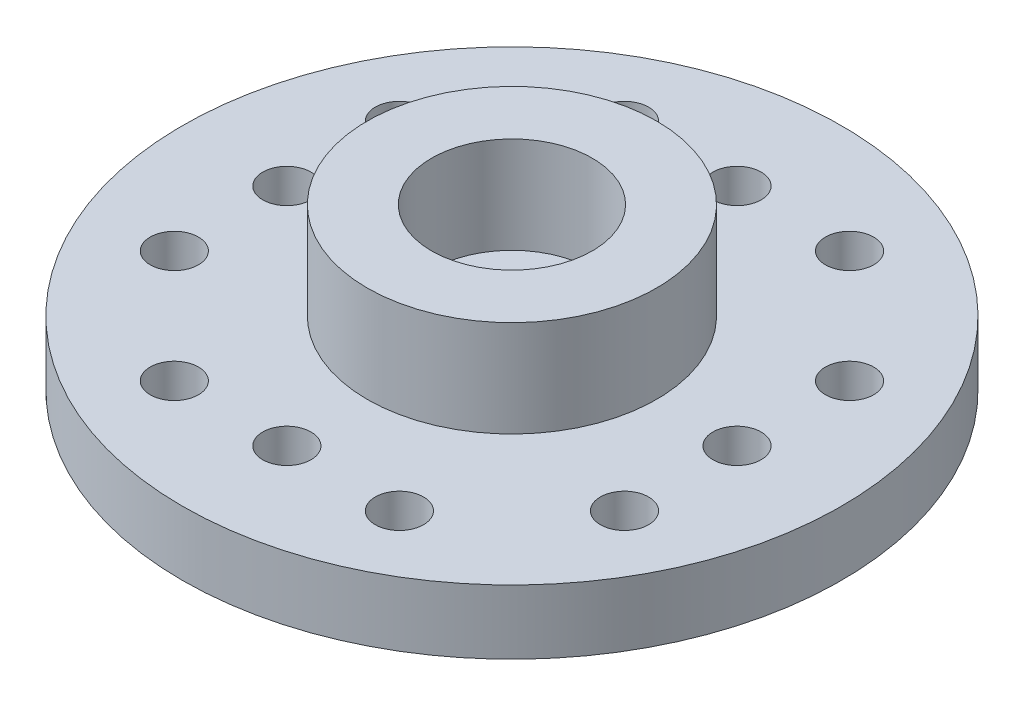
ISO-10303-21;
HEADER;
FILE_DESCRIPTION(('STEP AP214'),'2;1');
FILE_NAME('part.step','',(''),(''),'','','');
FILE_SCHEMA(('AUTOMOTIVE_DESIGN { 1 0 10303 214 1 1 1 1 }'));
ENDSEC;
DATA;
#1=APPLICATION_CONTEXT('core data for automotive mechanical design processes');
#2=APPLICATION_PROTOCOL_DEFINITION('international standard','automotive_design',2000,#1);
#3=PRODUCT_CONTEXT('',#1,'mechanical');
#4=PRODUCT('Part','Part','',(#3));
#5=PRODUCT_RELATED_PRODUCT_CATEGORY('part','',(#4));
#6=PRODUCT_DEFINITION_FORMATION('','',#4);
#7=PRODUCT_DEFINITION_CONTEXT('part definition',#1,'design');
#8=PRODUCT_DEFINITION('design','',#6,#7);
#9=PRODUCT_DEFINITION_SHAPE('','',#8);
#10=(LENGTH_UNIT() NAMED_UNIT(*) SI_UNIT(.MILLI.,.METRE.));
#11=(NAMED_UNIT(*) PLANE_ANGLE_UNIT() SI_UNIT($,.RADIAN.));
#12=(NAMED_UNIT(*) SI_UNIT($,.STERADIAN.) SOLID_ANGLE_UNIT());
#13=UNCERTAINTY_MEASURE_WITH_UNIT(LENGTH_MEASURE(1.E-05),#10,'distance_accuracy_value','');
#14=(GEOMETRIC_REPRESENTATION_CONTEXT(3) GLOBAL_UNCERTAINTY_ASSIGNED_CONTEXT((#13)) GLOBAL_UNIT_ASSIGNED_CONTEXT((#10,
#11,#12)) REPRESENTATION_CONTEXT('',''));
#15=CARTESIAN_POINT('',(0.,0.,0.));
#16=DIRECTION('',(0.,0.,1.));
#17=DIRECTION('',(1.,0.,0.));
#18=AXIS2_PLACEMENT_3D('',#15,#16,#17);
#19=CARTESIAN_POINT('',(0.,2.,0.));
#20=DIRECTION('',(0.,-1.,0.));
#21=DIRECTION('',(0.,0.,-1.));
#22=AXIS2_PLACEMENT_3D('',#19,#20,#21);
#23=CYLINDRICAL_SURFACE('',#22,10.25);
#24=CARTESIAN_POINT('',(0.,2.,0.));
#25=DIRECTION('',(0.,1.,0.));
#26=DIRECTION('',(0.,0.,1.));
#27=AXIS2_PLACEMENT_3D('',#24,#25,#26);
#28=CIRCLE('',#27,10.25);
#29=CARTESIAN_POINT('',(0.,2.,10.25));
#30=VERTEX_POINT('',#29);
#31=EDGE_CURVE('E45',#30,#30,#28,.T.);
#32=ORIENTED_EDGE('',*,*,#31,.F.);
#33=EDGE_LOOP('',(#32));
#34=FACE_BOUND('',#33,.T.);
#35=CARTESIAN_POINT('',(0.,0.,0.));
#36=DIRECTION('',(0.,1.,0.));
#37=DIRECTION('',(0.,0.,1.));
#38=AXIS2_PLACEMENT_3D('',#35,#36,#37);
#39=CIRCLE('',#38,10.25);
#40=CARTESIAN_POINT('',(0.,0.,10.25));
#41=VERTEX_POINT('',#40);
#42=EDGE_CURVE('E50',#41,#41,#39,.T.);
#43=ORIENTED_EDGE('',*,*,#42,.T.);
#44=EDGE_LOOP('',(#43));
#45=FACE_BOUND('',#44,.T.);
#46=ADVANCED_FACE('F37',(#34,#45),#23,.T.);
#47=CARTESIAN_POINT('',(0.,2.,0.));
#48=DIRECTION('',(0.,1.,0.));
#49=DIRECTION('',(0.,0.,1.));
#50=AXIS2_PLACEMENT_3D('',#47,#48,#49);
#51=PLANE('',#50);
#52=CARTESIAN_POINT('',(-6.99999999999999,2.,-3.50000000000002));
#53=DIRECTION('',(0.,1.,0.));
#54=DIRECTION('',(0.,0.,1.));
#55=AXIS2_PLACEMENT_3D('',#52,#53,#54);
#56=CIRCLE('',#55,0.75);
#57=CARTESIAN_POINT('',(-6.99999999999999,2.,-2.75000000000002));
#58=VERTEX_POINT('',#57);
#59=EDGE_CURVE('E93',#58,#58,#56,.T.);
#60=ORIENTED_EDGE('',*,*,#59,.F.);
#61=EDGE_LOOP('',(#60));
#62=FACE_BOUND('',#61,.T.);
#63=CARTESIAN_POINT('',(-7.00000000000001,2.,3.49999999999998));
#64=DIRECTION('',(0.,1.,0.));
#65=DIRECTION('',(0.,0.,1.));
#66=AXIS2_PLACEMENT_3D('',#63,#64,#65);
#67=CIRCLE('',#66,0.75);
#68=CARTESIAN_POINT('',(-7.00000000000001,2.,4.24999999999998));
#69=VERTEX_POINT('',#68);
#70=EDGE_CURVE('E100',#69,#69,#67,.T.);
#71=ORIENTED_EDGE('',*,*,#70,.F.);
#72=EDGE_LOOP('',(#71));
#73=FACE_BOUND('',#72,.T.);
#74=CARTESIAN_POINT('',(0.,2.,-7.));
#75=DIRECTION('',(0.,1.,0.));
#76=DIRECTION('',(0.,0.,1.));
#77=AXIS2_PLACEMENT_3D('',#74,#75,#76);
#78=CIRCLE('',#77,0.75);
#79=CARTESIAN_POINT('',(0.,2.,-6.25));
#80=VERTEX_POINT('',#79);
#81=EDGE_CURVE('E104',#80,#80,#78,.T.);
#82=ORIENTED_EDGE('',*,*,#81,.F.);
#83=EDGE_LOOP('',(#82));
#84=FACE_BOUND('',#83,.T.);
#85=CARTESIAN_POINT('',(3.5,2.,-7.));
#86=DIRECTION('',(0.,1.,0.));
#87=DIRECTION('',(0.,0.,1.));
#88=AXIS2_PLACEMENT_3D('',#85,#86,#87);
#89=CIRCLE('',#88,0.75);
#90=CARTESIAN_POINT('',(3.5,2.,-6.25));
#91=VERTEX_POINT('',#90);
#92=EDGE_CURVE('E108',#91,#91,#89,.T.);
#93=ORIENTED_EDGE('',*,*,#92,.F.);
#94=EDGE_LOOP('',(#93));
#95=FACE_BOUND('',#94,.T.);
#96=CARTESIAN_POINT('',(7.00000000000004,2.,-3.49999999999993));
#97=DIRECTION('',(0.,1.,0.));
#98=DIRECTION('',(0.,0.,1.));
#99=AXIS2_PLACEMENT_3D('',#96,#97,#98);
#100=CIRCLE('',#99,0.75);
#101=CARTESIAN_POINT('',(7.00000000000004,2.,-2.74999999999993));
#102=VERTEX_POINT('',#101);
#103=EDGE_CURVE('E112',#102,#102,#100,.T.);
#104=ORIENTED_EDGE('',*,*,#103,.F.);
#105=EDGE_LOOP('',(#104));
#106=FACE_BOUND('',#105,.T.);
#107=CARTESIAN_POINT('',(6.99999999999996,2.,3.50000000000007));
#108=DIRECTION('',(0.,1.,0.));
#109=DIRECTION('',(0.,0.,1.));
#110=AXIS2_PLACEMENT_3D('',#107,#108,#109);
#111=CIRCLE('',#110,0.75);
#112=CARTESIAN_POINT('',(6.99999999999996,2.,4.25000000000007));
#113=VERTEX_POINT('',#112);
#114=EDGE_CURVE('E116',#113,#113,#111,.T.);
#115=ORIENTED_EDGE('',*,*,#114,.F.);
#116=EDGE_LOOP('',(#115));
#117=FACE_BOUND('',#116,.T.);
#118=CARTESIAN_POINT('',(7.,2.,0.));
#119=DIRECTION('',(0.,1.,0.));
#120=DIRECTION('',(0.,0.,1.));
#121=AXIS2_PLACEMENT_3D('',#118,#119,#120);
#122=CIRCLE('',#121,0.75);
#123=CARTESIAN_POINT('',(7.,2.,0.750000000000073));
#124=VERTEX_POINT('',#123);
#125=EDGE_CURVE('E120',#124,#124,#122,.T.);
#126=ORIENTED_EDGE('',*,*,#125,.F.);
#127=EDGE_LOOP('',(#126));
#128=FACE_BOUND('',#127,.T.);
#129=CARTESIAN_POINT('',(-3.5,2.,-7.));
#130=DIRECTION('',(0.,1.,0.));
#131=DIRECTION('',(0.,0.,1.));
#132=AXIS2_PLACEMENT_3D('',#129,#130,#131);
#133=CIRCLE('',#132,0.75);
#134=CARTESIAN_POINT('',(-3.5,2.,-6.25));
#135=VERTEX_POINT('',#134);
#136=EDGE_CURVE('E124',#135,#135,#133,.T.);
#137=ORIENTED_EDGE('',*,*,#136,.F.);
#138=EDGE_LOOP('',(#137));
#139=FACE_BOUND('',#138,.T.);
#140=CARTESIAN_POINT('',(-7.,2.,0.));
#141=DIRECTION('',(0.,1.,0.));
#142=DIRECTION('',(0.,0.,1.));
#143=AXIS2_PLACEMENT_3D('',#140,#141,#142);
#144=CIRCLE('',#143,0.75);
#145=CARTESIAN_POINT('',(-7.,2.,0.749999999999976));
#146=VERTEX_POINT('',#145);
#147=EDGE_CURVE('E128',#146,#146,#144,.T.);
#148=ORIENTED_EDGE('',*,*,#147,.F.);
#149=EDGE_LOOP('',(#148));
#150=FACE_BOUND('',#149,.T.);
#151=CARTESIAN_POINT('',(3.5,2.,7.));
#152=DIRECTION('',(0.,1.,0.));
#153=DIRECTION('',(0.,0.,1.));
#154=AXIS2_PLACEMENT_3D('',#151,#152,#153);
#155=CIRCLE('',#154,0.75);
#156=CARTESIAN_POINT('',(3.5,2.,7.75));
#157=VERTEX_POINT('',#156);
#158=EDGE_CURVE('E72',#157,#157,#155,.T.);
#159=ORIENTED_EDGE('',*,*,#158,.F.);
#160=EDGE_LOOP('',(#159));
#161=FACE_BOUND('',#160,.T.);
#162=CARTESIAN_POINT('',(-3.5,2.,7.));
#163=DIRECTION('',(0.,1.,0.));
#164=DIRECTION('',(0.,0.,1.));
#165=AXIS2_PLACEMENT_3D('',#162,#163,#164);
#166=CIRCLE('',#165,0.75);
#167=CARTESIAN_POINT('',(-3.5,2.,7.75));
#168=VERTEX_POINT('',#167);
#169=EDGE_CURVE('E76',#168,#168,#166,.T.);
#170=ORIENTED_EDGE('',*,*,#169,.F.);
#171=EDGE_LOOP('',(#170));
#172=FACE_BOUND('',#171,.T.);
#173=CARTESIAN_POINT('',(0.,2.,7.));
#174=DIRECTION('',(0.,1.,0.));
#175=DIRECTION('',(0.,0.,1.));
#176=AXIS2_PLACEMENT_3D('',#173,#174,#175);
#177=CIRCLE('',#176,0.75);
#178=CARTESIAN_POINT('',(0.,2.,7.75));
#179=VERTEX_POINT('',#178);
#180=EDGE_CURVE('E80',#179,#179,#177,.T.);
#181=ORIENTED_EDGE('',*,*,#180,.F.);
#182=EDGE_LOOP('',(#181));
#183=FACE_BOUND('',#182,.T.);
#184=CARTESIAN_POINT('',(0.,2.,0.));
#185=DIRECTION('',(0.,1.,0.));
#186=DIRECTION('',(0.,0.,1.));
#187=AXIS2_PLACEMENT_3D('',#184,#185,#186);
#188=CIRCLE('',#187,4.5);
#189=CARTESIAN_POINT('',(0.,2.,4.5));
#190=VERTEX_POINT('',#189);
#191=EDGE_CURVE('E57',#190,#190,#188,.T.);
#192=ORIENTED_EDGE('',*,*,#191,.F.);
#193=EDGE_LOOP('',(#192));
#194=FACE_BOUND('',#193,.T.);
#195=ORIENTED_EDGE('',*,*,#31,.T.);
#196=EDGE_LOOP('',(#195));
#197=FACE_BOUND('',#196,.T.);
#198=ADVANCED_FACE('F175',(#62,#73,#84,#95,#106,#117,#128,#139,#150,#161,#172,#183,#194,#197),
#51,.T.);
#199=CARTESIAN_POINT('',(0.,0.,0.));
#200=DIRECTION('',(0.,1.,0.));
#201=DIRECTION('',(0.,0.,1.));
#202=AXIS2_PLACEMENT_3D('',#199,#200,#201);
#203=PLANE('',#202);
#204=CARTESIAN_POINT('',(-6.99999999999999,0.,-3.50000000000002));
#205=DIRECTION('',(0.,-1.,0.));
#206=DIRECTION('',(1.,0.,0.));
#207=AXIS2_PLACEMENT_3D('',#204,#205,#206);
#208=CIRCLE('',#207,0.75);
#209=CARTESIAN_POINT('',(-6.24999999999999,0.,-3.50000000000002));
#210=VERTEX_POINT('',#209);
#211=EDGE_CURVE('E136',#210,#210,#208,.T.);
#212=ORIENTED_EDGE('',*,*,#211,.F.);
#213=EDGE_LOOP('',(#212));
#214=FACE_BOUND('',#213,.T.);
#215=CARTESIAN_POINT('',(-7.00000000000001,0.,3.49999999999998));
#216=DIRECTION('',(0.,-1.,0.));
#217=DIRECTION('',(1.,0.,0.));
#218=AXIS2_PLACEMENT_3D('',#215,#216,#217);
#219=CIRCLE('',#218,0.75);
#220=CARTESIAN_POINT('',(-6.25000000000001,0.,3.49999999999998));
#221=VERTEX_POINT('',#220);
#222=EDGE_CURVE('E146',#221,#221,#219,.T.);
#223=ORIENTED_EDGE('',*,*,#222,.F.);
#224=EDGE_LOOP('',(#223));
#225=FACE_BOUND('',#224,.T.);
#226=CARTESIAN_POINT('',(0.,0.,-7.));
#227=DIRECTION('',(0.,-1.,0.));
#228=DIRECTION('',(0.,0.,1.));
#229=AXIS2_PLACEMENT_3D('',#226,#227,#228);
#230=CIRCLE('',#229,0.75);
#231=CARTESIAN_POINT('',(0.,0.,-6.25));
#232=VERTEX_POINT('',#231);
#233=EDGE_CURVE('E141',#232,#232,#230,.T.);
#234=ORIENTED_EDGE('',*,*,#233,.F.);
#235=EDGE_LOOP('',(#234));
#236=FACE_BOUND('',#235,.T.);
#237=CARTESIAN_POINT('',(3.5,0.,-7.));
#238=DIRECTION('',(0.,-1.,0.));
#239=DIRECTION('',(0.,0.,1.));
#240=AXIS2_PLACEMENT_3D('',#237,#238,#239);
#241=CIRCLE('',#240,0.75);
#242=CARTESIAN_POINT('',(3.5,0.,-6.25));
#243=VERTEX_POINT('',#242);
#244=EDGE_CURVE('E137',#243,#243,#241,.T.);
#245=ORIENTED_EDGE('',*,*,#244,.F.);
#246=EDGE_LOOP('',(#245));
#247=FACE_BOUND('',#246,.T.);
#248=CARTESIAN_POINT('',(7.00000000000004,0.,-3.49999999999993));
#249=DIRECTION('',(0.,-1.,0.));
#250=DIRECTION('',(-1.,0.,0.));
#251=AXIS2_PLACEMENT_3D('',#248,#249,#250);
#252=CIRCLE('',#251,0.75);
#253=CARTESIAN_POINT('',(6.25000000000004,0.,-3.49999999999993));
#254=VERTEX_POINT('',#253);
#255=EDGE_CURVE('E161',#254,#254,#252,.T.);
#256=ORIENTED_EDGE('',*,*,#255,.F.);
#257=EDGE_LOOP('',(#256));
#258=FACE_BOUND('',#257,.T.);
#259=CARTESIAN_POINT('',(6.99999999999996,0.,3.50000000000007));
#260=DIRECTION('',(0.,-1.,0.));
#261=DIRECTION('',(-1.,0.,0.));
#262=AXIS2_PLACEMENT_3D('',#259,#260,#261);
#263=CIRCLE('',#262,0.75);
#264=CARTESIAN_POINT('',(6.24999999999996,0.,3.50000000000007));
#265=VERTEX_POINT('',#264);
#266=EDGE_CURVE('E157',#265,#265,#263,.T.);
#267=ORIENTED_EDGE('',*,*,#266,.F.);
#268=EDGE_LOOP('',(#267));
#269=FACE_BOUND('',#268,.T.);
#270=CARTESIAN_POINT('',(7.,0.,0.));
#271=DIRECTION('',(0.,-1.,0.));
#272=DIRECTION('',(-1.,0.,0.));
#273=AXIS2_PLACEMENT_3D('',#270,#271,#272);
#274=CIRCLE('',#273,0.75);
#275=CARTESIAN_POINT('',(6.25,0.,0.));
#276=VERTEX_POINT('',#275);
#277=EDGE_CURVE('E153',#276,#276,#274,.T.);
#278=ORIENTED_EDGE('',*,*,#277,.F.);
#279=EDGE_LOOP('',(#278));
#280=FACE_BOUND('',#279,.T.);
#281=CARTESIAN_POINT('',(-3.5,0.,-7.));
#282=DIRECTION('',(0.,-1.,0.));
#283=DIRECTION('',(0.,0.,1.));
#284=AXIS2_PLACEMENT_3D('',#281,#282,#283);
#285=CIRCLE('',#284,0.75);
#286=CARTESIAN_POINT('',(-3.5,0.,-6.25));
#287=VERTEX_POINT('',#286);
#288=EDGE_CURVE('E142',#287,#287,#285,.T.);
#289=ORIENTED_EDGE('',*,*,#288,.F.);
#290=EDGE_LOOP('',(#289));
#291=FACE_BOUND('',#290,.T.);
#292=CARTESIAN_POINT('',(-7.,0.,0.));
#293=DIRECTION('',(0.,-1.,0.));
#294=DIRECTION('',(1.,0.,0.));
#295=AXIS2_PLACEMENT_3D('',#292,#293,#294);
#296=CIRCLE('',#295,0.75);
#297=CARTESIAN_POINT('',(-6.25,0.,0.));
#298=VERTEX_POINT('',#297);
#299=EDGE_CURVE('E132',#298,#298,#296,.T.);
#300=ORIENTED_EDGE('',*,*,#299,.F.);
#301=EDGE_LOOP('',(#300));
#302=FACE_BOUND('',#301,.T.);
#303=CARTESIAN_POINT('',(3.5,0.,7.));
#304=DIRECTION('',(0.,-1.,0.));
#305=DIRECTION('',(0.,0.,-1.));
#306=AXIS2_PLACEMENT_3D('',#303,#304,#305);
#307=CIRCLE('',#306,0.75);
#308=CARTESIAN_POINT('',(3.5,0.,6.25));
#309=VERTEX_POINT('',#308);
#310=EDGE_CURVE('E89',#309,#309,#307,.T.);
#311=ORIENTED_EDGE('',*,*,#310,.F.);
#312=EDGE_LOOP('',(#311));
#313=FACE_BOUND('',#312,.T.);
#314=CARTESIAN_POINT('',(-3.5,0.,7.));
#315=DIRECTION('',(0.,-1.,0.));
#316=DIRECTION('',(0.,0.,-1.));
#317=AXIS2_PLACEMENT_3D('',#314,#315,#316);
#318=CIRCLE('',#317,0.75);
#319=CARTESIAN_POINT('',(-3.5,0.,6.25));
#320=VERTEX_POINT('',#319);
#321=EDGE_CURVE('E88',#320,#320,#318,.T.);
#322=ORIENTED_EDGE('',*,*,#321,.F.);
#323=EDGE_LOOP('',(#322));
#324=FACE_BOUND('',#323,.T.);
#325=CARTESIAN_POINT('',(0.,0.,7.));
#326=DIRECTION('',(0.,-1.,0.));
#327=DIRECTION('',(0.,0.,-1.));
#328=AXIS2_PLACEMENT_3D('',#325,#326,#327);
#329=CIRCLE('',#328,0.75);
#330=CARTESIAN_POINT('',(0.,0.,6.25));
#331=VERTEX_POINT('',#330);
#332=EDGE_CURVE('E84',#331,#331,#329,.T.);
#333=ORIENTED_EDGE('',*,*,#332,.F.);
#334=EDGE_LOOP('',(#333));
#335=FACE_BOUND('',#334,.T.);
#336=CARTESIAN_POINT('',(0.,0.,0.));
#337=DIRECTION('',(0.,-1.,0.));
#338=DIRECTION('',(0.,0.,-1.));
#339=AXIS2_PLACEMENT_3D('',#336,#337,#338);
#340=CIRCLE('',#339,1.5);
#341=CARTESIAN_POINT('',(0.,0.,-1.5));
#342=VERTEX_POINT('',#341);
#343=EDGE_CURVE('E68',#342,#342,#340,.T.);
#344=ORIENTED_EDGE('',*,*,#343,.F.);
#345=EDGE_LOOP('',(#344));
#346=FACE_BOUND('',#345,.T.);
#347=ORIENTED_EDGE('',*,*,#42,.F.);
#348=EDGE_LOOP('',(#347));
#349=FACE_BOUND('',#348,.T.);
#350=ADVANCED_FACE('F171',(#214,#225,#236,#247,#258,#269,#280,#291,#302,#313,#324,#335,#346,
#349),#203,.F.);
#351=CARTESIAN_POINT('',(0.,5.,0.));
#352=DIRECTION('',(0.,1.,0.));
#353=DIRECTION('',(0.,0.,1.));
#354=AXIS2_PLACEMENT_3D('',#351,#352,#353);
#355=PLANE('',#354);
#356=CARTESIAN_POINT('',(0.,5.,0.));
#357=DIRECTION('',(0.,1.,0.));
#358=DIRECTION('',(0.,0.,1.));
#359=AXIS2_PLACEMENT_3D('',#356,#357,#358);
#360=CIRCLE('',#359,4.5);
#361=CARTESIAN_POINT('',(0.,5.,4.5));
#362=VERTEX_POINT('',#361);
#363=EDGE_CURVE('E55',#362,#362,#360,.T.);
#364=ORIENTED_EDGE('',*,*,#363,.T.);
#365=EDGE_LOOP('',(#364));
#366=FACE_BOUND('',#365,.T.);
#367=CARTESIAN_POINT('',(0.,5.,0.));
#368=DIRECTION('',(0.,1.,0.));
#369=DIRECTION('',(0.,0.,1.));
#370=AXIS2_PLACEMENT_3D('',#367,#368,#369);
#371=CIRCLE('',#370,2.5);
#372=CARTESIAN_POINT('',(0.,5.,2.5));
#373=VERTEX_POINT('',#372);
#374=EDGE_CURVE('E61',#373,#373,#371,.T.);
#375=ORIENTED_EDGE('',*,*,#374,.F.);
#376=EDGE_LOOP('',(#375));
#377=FACE_BOUND('',#376,.T.);
#378=ADVANCED_FACE('F174',(#366,#377),#355,.T.);
#379=CARTESIAN_POINT('',(0.,5.,0.));
#380=DIRECTION('',(0.,-1.,0.));
#381=DIRECTION('',(0.,0.,-1.));
#382=AXIS2_PLACEMENT_3D('',#379,#380,#381);
#383=CYLINDRICAL_SURFACE('',#382,4.5);
#384=ORIENTED_EDGE('',*,*,#363,.F.);
#385=EDGE_LOOP('',(#384));
#386=FACE_BOUND('',#385,.T.);
#387=ORIENTED_EDGE('',*,*,#191,.T.);
#388=EDGE_LOOP('',(#387));
#389=FACE_BOUND('',#388,.T.);
#390=ADVANCED_FACE('F219',(#386,#389),#383,.T.);
#391=CARTESIAN_POINT('',(0.,5.,0.));
#392=DIRECTION('',(0.,-1.,0.));
#393=DIRECTION('',(0.,0.,-1.));
#394=AXIS2_PLACEMENT_3D('',#391,#392,#393);
#395=CYLINDRICAL_SURFACE('',#394,2.5);
#396=ORIENTED_EDGE('',*,*,#374,.T.);
#397=EDGE_LOOP('',(#396));
#398=FACE_BOUND('',#397,.T.);
#399=CARTESIAN_POINT('',(0.,2.,0.));
#400=DIRECTION('',(0.,1.,0.));
#401=DIRECTION('',(0.,0.,1.));
#402=AXIS2_PLACEMENT_3D('',#399,#400,#401);
#403=CIRCLE('',#402,2.5);
#404=CARTESIAN_POINT('',(0.,2.,2.5));
#405=VERTEX_POINT('',#404);
#406=EDGE_CURVE('E10',#405,#405,#403,.F.);
#407=ORIENTED_EDGE('',*,*,#406,.T.);
#408=EDGE_LOOP('',(#407));
#409=FACE_BOUND('',#408,.T.);
#410=ADVANCED_FACE('F210',(#398,#409),#395,.F.);
#411=CARTESIAN_POINT('',(0.,2.,0.));
#412=DIRECTION('',(0.,1.,0.));
#413=DIRECTION('',(0.,0.,1.));
#414=AXIS2_PLACEMENT_3D('',#411,#412,#413);
#415=CIRCLE('',#414,1.5);
#416=CARTESIAN_POINT('',(0.,2.,1.5));
#417=VERTEX_POINT('',#416);
#418=EDGE_CURVE('E40',#417,#417,#415,.T.);
#419=ORIENTED_EDGE('',*,*,#418,.F.);
#420=EDGE_LOOP('',(#419));
#421=FACE_BOUND('',#420,.T.);
#422=ORIENTED_EDGE('',*,*,#406,.F.);
#423=EDGE_LOOP('',(#422));
#424=FACE_BOUND('',#423,.T.);
#425=ADVANCED_FACE('F200',(#421,#424),#51,.T.);
#426=CARTESIAN_POINT('',(0.,5.,0.));
#427=DIRECTION('',(0.,-1.,0.));
#428=DIRECTION('',(0.,0.,-1.));
#429=AXIS2_PLACEMENT_3D('',#426,#427,#428);
#430=CYLINDRICAL_SURFACE('',#429,1.5);
#431=ORIENTED_EDGE('',*,*,#418,.T.);
#432=EDGE_LOOP('',(#431));
#433=FACE_BOUND('',#432,.T.);
#434=ORIENTED_EDGE('',*,*,#343,.T.);
#435=EDGE_LOOP('',(#434));
#436=FACE_BOUND('',#435,.T.);
#437=ADVANCED_FACE('F209',(#433,#436),#430,.F.);
#438=CARTESIAN_POINT('',(0.,5.,7.));
#439=DIRECTION('',(0.,-1.,0.));
#440=DIRECTION('',(0.,0.,-1.));
#441=AXIS2_PLACEMENT_3D('',#438,#439,#440);
#442=CYLINDRICAL_SURFACE('',#441,0.75);
#443=ORIENTED_EDGE('',*,*,#180,.T.);
#444=EDGE_LOOP('',(#443));
#445=FACE_BOUND('',#444,.T.);
#446=ORIENTED_EDGE('',*,*,#332,.T.);
#447=EDGE_LOOP('',(#446));
#448=FACE_BOUND('',#447,.T.);
#449=ADVANCED_FACE('F216',(#445,#448),#442,.F.);
#450=CARTESIAN_POINT('',(-3.5,5.,7.));
#451=DIRECTION('',(0.,-1.,0.));
#452=DIRECTION('',(0.,0.,-1.));
#453=AXIS2_PLACEMENT_3D('',#450,#451,#452);
#454=CYLINDRICAL_SURFACE('',#453,0.75);
#455=ORIENTED_EDGE('',*,*,#169,.T.);
#456=EDGE_LOOP('',(#455));
#457=FACE_BOUND('',#456,.T.);
#458=ORIENTED_EDGE('',*,*,#321,.T.);
#459=EDGE_LOOP('',(#458));
#460=FACE_BOUND('',#459,.T.);
#461=ADVANCED_FACE('F273',(#457,#460),#454,.F.);
#462=CARTESIAN_POINT('',(3.5,5.,7.));
#463=DIRECTION('',(0.,-1.,0.));
#464=DIRECTION('',(0.,0.,-1.));
#465=AXIS2_PLACEMENT_3D('',#462,#463,#464);
#466=CYLINDRICAL_SURFACE('',#465,0.75);
#467=ORIENTED_EDGE('',*,*,#158,.T.);
#468=EDGE_LOOP('',(#467));
#469=FACE_BOUND('',#468,.T.);
#470=ORIENTED_EDGE('',*,*,#310,.T.);
#471=EDGE_LOOP('',(#470));
#472=FACE_BOUND('',#471,.T.);
#473=ADVANCED_FACE('F282',(#469,#472),#466,.F.);
#474=CARTESIAN_POINT('',(-7.,5.,0.));
#475=DIRECTION('',(0.,-1.,0.));
#476=DIRECTION('',(0.,0.,-1.));
#477=AXIS2_PLACEMENT_3D('',#474,#475,#476);
#478=CYLINDRICAL_SURFACE('',#477,0.75);
#479=ORIENTED_EDGE('',*,*,#147,.T.);
#480=EDGE_LOOP('',(#479));
#481=FACE_BOUND('',#480,.T.);
#482=ORIENTED_EDGE('',*,*,#299,.T.);
#483=EDGE_LOOP('',(#482));
#484=FACE_BOUND('',#483,.T.);
#485=ADVANCED_FACE('F291',(#481,#484),#478,.F.);
#486=CARTESIAN_POINT('',(-3.5,5.,-7.));
#487=DIRECTION('',(0.,-1.,0.));
#488=DIRECTION('',(0.,0.,-1.));
#489=AXIS2_PLACEMENT_3D('',#486,#487,#488);
#490=CYLINDRICAL_SURFACE('',#489,0.75);
#491=ORIENTED_EDGE('',*,*,#136,.T.);
#492=EDGE_LOOP('',(#491));
#493=FACE_BOUND('',#492,.T.);
#494=ORIENTED_EDGE('',*,*,#288,.T.);
#495=EDGE_LOOP('',(#494));
#496=FACE_BOUND('',#495,.T.);
#497=ADVANCED_FACE('F310',(#493,#496),#490,.F.);
#498=CARTESIAN_POINT('',(7.,5.,0.));
#499=DIRECTION('',(0.,-1.,0.));
#500=DIRECTION('',(0.,0.,-1.));
#501=AXIS2_PLACEMENT_3D('',#498,#499,#500);
#502=CYLINDRICAL_SURFACE('',#501,0.75);
#503=ORIENTED_EDGE('',*,*,#125,.T.);
#504=EDGE_LOOP('',(#503));
#505=FACE_BOUND('',#504,.T.);
#506=ORIENTED_EDGE('',*,*,#277,.T.);
#507=EDGE_LOOP('',(#506));
#508=FACE_BOUND('',#507,.T.);
#509=ADVANCED_FACE('F320',(#505,#508),#502,.F.);
#510=CARTESIAN_POINT('',(6.99999999999996,5.,3.50000000000007));
#511=DIRECTION('',(0.,-1.,0.));
#512=DIRECTION('',(0.,0.,-1.));
#513=AXIS2_PLACEMENT_3D('',#510,#511,#512);
#514=CYLINDRICAL_SURFACE('',#513,0.75);
#515=ORIENTED_EDGE('',*,*,#114,.T.);
#516=EDGE_LOOP('',(#515));
#517=FACE_BOUND('',#516,.T.);
#518=ORIENTED_EDGE('',*,*,#266,.T.);
#519=EDGE_LOOP('',(#518));
#520=FACE_BOUND('',#519,.T.);
#521=ADVANCED_FACE('F169',(#517,#520),#514,.F.);
#522=CARTESIAN_POINT('',(7.00000000000004,5.,-3.49999999999993));
#523=DIRECTION('',(0.,-1.,0.));
#524=DIRECTION('',(0.,0.,-1.));
#525=AXIS2_PLACEMENT_3D('',#522,#523,#524);
#526=CYLINDRICAL_SURFACE('',#525,0.75);
#527=ORIENTED_EDGE('',*,*,#103,.T.);
#528=EDGE_LOOP('',(#527));
#529=FACE_BOUND('',#528,.T.);
#530=ORIENTED_EDGE('',*,*,#255,.T.);
#531=EDGE_LOOP('',(#530));
#532=FACE_BOUND('',#531,.T.);
#533=ADVANCED_FACE('F339',(#529,#532),#526,.F.);
#534=CARTESIAN_POINT('',(3.5,5.,-7.));
#535=DIRECTION('',(0.,-1.,0.));
#536=DIRECTION('',(0.,0.,-1.));
#537=AXIS2_PLACEMENT_3D('',#534,#535,#536);
#538=CYLINDRICAL_SURFACE('',#537,0.75);
#539=ORIENTED_EDGE('',*,*,#92,.T.);
#540=EDGE_LOOP('',(#539));
#541=FACE_BOUND('',#540,.T.);
#542=ORIENTED_EDGE('',*,*,#244,.T.);
#543=EDGE_LOOP('',(#542));
#544=FACE_BOUND('',#543,.T.);
#545=ADVANCED_FACE('F349',(#541,#544),#538,.F.);
#546=CARTESIAN_POINT('',(0.,5.,-7.));
#547=DIRECTION('',(0.,-1.,0.));
#548=DIRECTION('',(0.,0.,-1.));
#549=AXIS2_PLACEMENT_3D('',#546,#547,#548);
#550=CYLINDRICAL_SURFACE('',#549,0.75);
#551=ORIENTED_EDGE('',*,*,#81,.T.);
#552=EDGE_LOOP('',(#551));
#553=FACE_BOUND('',#552,.T.);
#554=ORIENTED_EDGE('',*,*,#233,.T.);
#555=EDGE_LOOP('',(#554));
#556=FACE_BOUND('',#555,.T.);
#557=ADVANCED_FACE('F359',(#553,#556),#550,.F.);
#558=CARTESIAN_POINT('',(-7.00000000000001,5.,3.49999999999998));
#559=DIRECTION('',(0.,-1.,0.));
#560=DIRECTION('',(0.,0.,-1.));
#561=AXIS2_PLACEMENT_3D('',#558,#559,#560);
#562=CYLINDRICAL_SURFACE('',#561,0.75);
#563=ORIENTED_EDGE('',*,*,#70,.T.);
#564=EDGE_LOOP('',(#563));
#565=FACE_BOUND('',#564,.T.);
#566=ORIENTED_EDGE('',*,*,#222,.T.);
#567=EDGE_LOOP('',(#566));
#568=FACE_BOUND('',#567,.T.);
#569=ADVANCED_FACE('F369',(#565,#568),#562,.F.);
#570=CARTESIAN_POINT('',(-6.99999999999999,5.,-3.50000000000002));
#571=DIRECTION('',(0.,-1.,0.));
#572=DIRECTION('',(0.,0.,-1.));
#573=AXIS2_PLACEMENT_3D('',#570,#571,#572);
#574=CYLINDRICAL_SURFACE('',#573,0.75);
#575=ORIENTED_EDGE('',*,*,#59,.T.);
#576=EDGE_LOOP('',(#575));
#577=FACE_BOUND('',#576,.T.);
#578=ORIENTED_EDGE('',*,*,#211,.T.);
#579=EDGE_LOOP('',(#578));
#580=FACE_BOUND('',#579,.T.);
#581=ADVANCED_FACE('F379',(#577,#580),#574,.F.);
#582=CLOSED_SHELL('',(#46,#198,#350,#378,#390,#410,#425,#437,#449,#461,#473,#485,#497,#509,#521,
#533,#545,#557,#569,#581));
#583=MANIFOLD_SOLID_BREP('B2',#582);
#584=ADVANCED_BREP_SHAPE_REPRESENTATION('',(#18,#583),#14);
#585=SHAPE_DEFINITION_REPRESENTATION(#9,#584);
ENDSEC;
END-ISO-10303-21;
